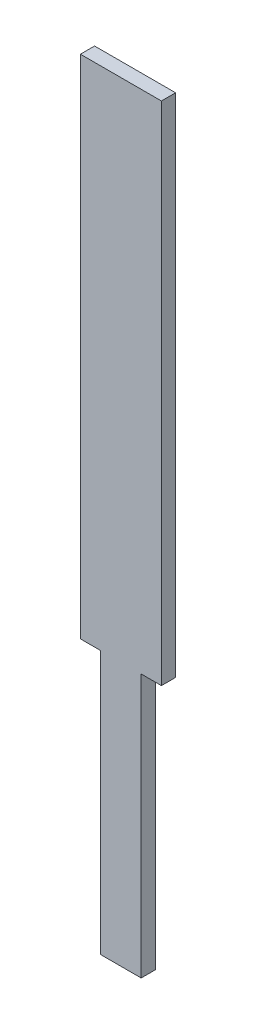
ISO-10303-21;
HEADER;
FILE_DESCRIPTION(('STEP AP214'),'2;1');
FILE_NAME('part.step','',(''),(''),'','','');
FILE_SCHEMA(('AUTOMOTIVE_DESIGN { 1 0 10303 214 1 1 1 1 }'));
ENDSEC;
DATA;
#1=APPLICATION_CONTEXT('core data for automotive mechanical design processes');
#2=APPLICATION_PROTOCOL_DEFINITION('international standard','automotive_design',2000,#1);
#3=PRODUCT_CONTEXT('',#1,'mechanical');
#4=PRODUCT('Part','Part','',(#3));
#5=PRODUCT_RELATED_PRODUCT_CATEGORY('part','',(#4));
#6=PRODUCT_DEFINITION_FORMATION('','',#4);
#7=PRODUCT_DEFINITION_CONTEXT('part definition',#1,'design');
#8=PRODUCT_DEFINITION('design','',#6,#7);
#9=PRODUCT_DEFINITION_SHAPE('','',#8);
#10=(LENGTH_UNIT() NAMED_UNIT(*) SI_UNIT(.MILLI.,.METRE.));
#11=(NAMED_UNIT(*) PLANE_ANGLE_UNIT() SI_UNIT($,.RADIAN.));
#12=(NAMED_UNIT(*) SI_UNIT($,.STERADIAN.) SOLID_ANGLE_UNIT());
#13=UNCERTAINTY_MEASURE_WITH_UNIT(LENGTH_MEASURE(1.E-05),#10,'distance_accuracy_value','');
#14=(GEOMETRIC_REPRESENTATION_CONTEXT(3) GLOBAL_UNCERTAINTY_ASSIGNED_CONTEXT((#13)) GLOBAL_UNIT_ASSIGNED_CONTEXT((#10,
#11,#12)) REPRESENTATION_CONTEXT('',''));
#15=CARTESIAN_POINT('',(0.,0.,0.));
#16=DIRECTION('',(0.,0.,1.));
#17=DIRECTION('',(1.,0.,0.));
#18=AXIS2_PLACEMENT_3D('',#15,#16,#17);
#19=CARTESIAN_POINT('',(0.,-125.,7.));
#20=DIRECTION('',(0.,1.,0.));
#21=DIRECTION('',(0.,0.,1.));
#22=AXIS2_PLACEMENT_3D('',#19,#20,#21);
#23=PLANE('',#22);
#24=DIRECTION('',(1.,0.,0.));
#25=VECTOR('',#24,1.);
#26=CARTESIAN_POINT('',(0.,-125.,0.));
#27=LINE('',#26,#25);
#28=CARTESIAN_POINT('',(-20.,-125.,0.));
#29=VERTEX_POINT('',#28);
#30=CARTESIAN_POINT('',(-10.,-125.,0.));
#31=VERTEX_POINT('',#30);
#32=EDGE_CURVE('E134',#29,#31,#27,.T.);
#33=ORIENTED_EDGE('',*,*,#32,.T.);
#34=DIRECTION('',(0.,0.,-1.));
#35=VECTOR('',#34,1.);
#36=CARTESIAN_POINT('',(-10.,-125.,7.));
#37=LINE('',#36,#35);
#38=CARTESIAN_POINT('',(-10.,-125.,7.));
#39=VERTEX_POINT('',#38);
#40=EDGE_CURVE('E11',#39,#31,#37,.T.);
#41=ORIENTED_EDGE('',*,*,#40,.F.);
#42=DIRECTION('',(1.,0.,0.));
#43=VECTOR('',#42,1.);
#44=CARTESIAN_POINT('',(0.,-125.,7.));
#45=LINE('',#44,#43);
#46=CARTESIAN_POINT('',(-20.,-125.,7.));
#47=VERTEX_POINT('',#46);
#48=EDGE_CURVE('E151',#47,#39,#45,.T.);
#49=ORIENTED_EDGE('',*,*,#48,.F.);
#50=DIRECTION('',(0.,0.,-1.));
#51=VECTOR('',#50,1.);
#52=CARTESIAN_POINT('',(-20.,-125.,7.));
#53=LINE('',#52,#51);
#54=EDGE_CURVE('E52',#47,#29,#53,.T.);
#55=ORIENTED_EDGE('',*,*,#54,.T.);
#56=EDGE_LOOP('',(#33,#41,#49,#55));
#57=FACE_BOUND('',#56,.T.);
#58=ADVANCED_FACE('F35',(#57),#23,.F.);
#59=CARTESIAN_POINT('',(-10.,0.,7.));
#60=DIRECTION('',(1.,0.,0.));
#61=DIRECTION('',(0.,1.,0.));
#62=AXIS2_PLACEMENT_3D('',#59,#60,#61);
#63=PLANE('',#62);
#64=DIRECTION('',(0.,-1.,0.));
#65=VECTOR('',#64,1.);
#66=CARTESIAN_POINT('',(-10.,0.,0.));
#67=LINE('',#66,#65);
#68=CARTESIAN_POINT('',(-9.99999999999999,-255.,0.));
#69=VERTEX_POINT('',#68);
#70=EDGE_CURVE('E136',#31,#69,#67,.T.);
#71=ORIENTED_EDGE('',*,*,#70,.T.);
#72=DIRECTION('',(0.,0.,-1.));
#73=VECTOR('',#72,1.);
#74=CARTESIAN_POINT('',(-9.99999999999999,-255.,7.));
#75=LINE('',#74,#73);
#76=CARTESIAN_POINT('',(-9.99999999999999,-255.,7.));
#77=VERTEX_POINT('',#76);
#78=EDGE_CURVE('E44',#77,#69,#75,.T.);
#79=ORIENTED_EDGE('',*,*,#78,.F.);
#80=DIRECTION('',(0.,-1.,0.));
#81=VECTOR('',#80,1.);
#82=CARTESIAN_POINT('',(-10.,0.,7.));
#83=LINE('',#82,#81);
#84=EDGE_CURVE('E90',#39,#77,#83,.T.);
#85=ORIENTED_EDGE('',*,*,#84,.F.);
#86=ORIENTED_EDGE('',*,*,#40,.T.);
#87=EDGE_LOOP('',(#71,#79,#85,#86));
#88=FACE_BOUND('',#87,.T.);
#89=ADVANCED_FACE('F37',(#88),#63,.F.);
#90=CARTESIAN_POINT('',(0.,-255.,7.));
#91=DIRECTION('',(0.,1.,0.));
#92=DIRECTION('',(0.,0.,1.));
#93=AXIS2_PLACEMENT_3D('',#90,#91,#92);
#94=PLANE('',#93);
#95=DIRECTION('',(1.,0.,0.));
#96=VECTOR('',#95,1.);
#97=CARTESIAN_POINT('',(0.,-255.,0.));
#98=LINE('',#97,#96);
#99=CARTESIAN_POINT('',(10.,-255.,0.));
#100=VERTEX_POINT('',#99);
#101=EDGE_CURVE('E139',#69,#100,#98,.T.);
#102=ORIENTED_EDGE('',*,*,#101,.T.);
#103=DIRECTION('',(0.,0.,-1.));
#104=VECTOR('',#103,1.);
#105=CARTESIAN_POINT('',(10.,-255.,7.));
#106=LINE('',#105,#104);
#107=CARTESIAN_POINT('',(10.,-255.,7.));
#108=VERTEX_POINT('',#107);
#109=EDGE_CURVE('E157',#108,#100,#106,.T.);
#110=ORIENTED_EDGE('',*,*,#109,.F.);
#111=DIRECTION('',(1.,0.,0.));
#112=VECTOR('',#111,1.);
#113=CARTESIAN_POINT('',(0.,-255.,7.));
#114=LINE('',#113,#112);
#115=EDGE_CURVE('E164',#77,#108,#114,.T.);
#116=ORIENTED_EDGE('',*,*,#115,.F.);
#117=ORIENTED_EDGE('',*,*,#78,.T.);
#118=EDGE_LOOP('',(#102,#110,#116,#117));
#119=FACE_BOUND('',#118,.T.);
#120=ADVANCED_FACE('F162',(#119),#94,.F.);
#121=CARTESIAN_POINT('',(9.99999999999998,0.,7.));
#122=DIRECTION('',(1.,0.,0.));
#123=DIRECTION('',(0.,1.,0.));
#124=AXIS2_PLACEMENT_3D('',#121,#122,#123);
#125=PLANE('',#124);
#126=DIRECTION('',(0.,-1.,0.));
#127=VECTOR('',#126,1.);
#128=CARTESIAN_POINT('',(9.99999999999998,0.,0.));
#129=LINE('',#128,#127);
#130=CARTESIAN_POINT('',(10.,-125.,0.));
#131=VERTEX_POINT('',#130);
#132=EDGE_CURVE('E142',#131,#100,#129,.T.);
#133=ORIENTED_EDGE('',*,*,#132,.F.);
#134=DIRECTION('',(0.,0.,-1.));
#135=VECTOR('',#134,1.);
#136=CARTESIAN_POINT('',(10.,-125.,7.));
#137=LINE('',#136,#135);
#138=CARTESIAN_POINT('',(10.,-125.,7.));
#139=VERTEX_POINT('',#138);
#140=EDGE_CURVE('E155',#139,#131,#137,.T.);
#141=ORIENTED_EDGE('',*,*,#140,.F.);
#142=DIRECTION('',(0.,-1.,0.));
#143=VECTOR('',#142,1.);
#144=CARTESIAN_POINT('',(9.99999999999998,0.,7.));
#145=LINE('',#144,#143);
#146=EDGE_CURVE('E172',#139,#108,#145,.T.);
#147=ORIENTED_EDGE('',*,*,#146,.T.);
#148=ORIENTED_EDGE('',*,*,#109,.T.);
#149=EDGE_LOOP('',(#133,#141,#147,#148));
#150=FACE_BOUND('',#149,.T.);
#151=ADVANCED_FACE('F170',(#150),#125,.T.);
#152=CARTESIAN_POINT('',(20.,-125.,0.));
#153=VERTEX_POINT('',#152);
#154=EDGE_CURVE('E137',#131,#153,#27,.T.);
#155=ORIENTED_EDGE('',*,*,#154,.T.);
#156=DIRECTION('',(0.,0.,-1.));
#157=VECTOR('',#156,1.);
#158=CARTESIAN_POINT('',(20.,-125.,7.));
#159=LINE('',#158,#157);
#160=CARTESIAN_POINT('',(20.,-125.,7.));
#161=VERTEX_POINT('',#160);
#162=EDGE_CURVE('E126',#161,#153,#159,.T.);
#163=ORIENTED_EDGE('',*,*,#162,.F.);
#164=EDGE_CURVE('E114',#139,#161,#45,.T.);
#165=ORIENTED_EDGE('',*,*,#164,.F.);
#166=ORIENTED_EDGE('',*,*,#140,.T.);
#167=EDGE_LOOP('',(#155,#163,#165,#166));
#168=FACE_BOUND('',#167,.T.);
#169=ADVANCED_FACE('F183',(#168),#23,.F.);
#170=CARTESIAN_POINT('',(20.,0.,7.));
#171=DIRECTION('',(-1.,0.,0.));
#172=DIRECTION('',(0.,-1.,0.));
#173=AXIS2_PLACEMENT_3D('',#170,#171,#172);
#174=PLANE('',#173);
#175=DIRECTION('',(0.,1.,0.));
#176=VECTOR('',#175,1.);
#177=CARTESIAN_POINT('',(20.,0.,0.));
#178=LINE('',#177,#176);
#179=CARTESIAN_POINT('',(20.,125.,0.));
#180=VERTEX_POINT('',#179);
#181=EDGE_CURVE('E123',#153,#180,#178,.T.);
#182=ORIENTED_EDGE('',*,*,#181,.T.);
#183=DIRECTION('',(0.,0.,-1.));
#184=VECTOR('',#183,1.);
#185=CARTESIAN_POINT('',(20.,125.,7.));
#186=LINE('',#185,#184);
#187=CARTESIAN_POINT('',(20.,125.,7.));
#188=VERTEX_POINT('',#187);
#189=EDGE_CURVE('E120',#188,#180,#186,.T.);
#190=ORIENTED_EDGE('',*,*,#189,.F.);
#191=DIRECTION('',(0.,1.,0.));
#192=VECTOR('',#191,1.);
#193=CARTESIAN_POINT('',(20.,0.,7.));
#194=LINE('',#193,#192);
#195=EDGE_CURVE('E106',#161,#188,#194,.T.);
#196=ORIENTED_EDGE('',*,*,#195,.F.);
#197=ORIENTED_EDGE('',*,*,#162,.T.);
#198=EDGE_LOOP('',(#182,#190,#196,#197));
#199=FACE_BOUND('',#198,.T.);
#200=ADVANCED_FACE('F121',(#199),#174,.F.);
#201=CARTESIAN_POINT('',(0.,125.,7.));
#202=DIRECTION('',(0.,1.,0.));
#203=DIRECTION('',(0.,0.,1.));
#204=AXIS2_PLACEMENT_3D('',#201,#202,#203);
#205=PLANE('',#204);
#206=DIRECTION('',(1.,0.,0.));
#207=VECTOR('',#206,1.);
#208=CARTESIAN_POINT('',(0.,125.,0.));
#209=LINE('',#208,#207);
#210=CARTESIAN_POINT('',(-20.,125.,0.));
#211=VERTEX_POINT('',#210);
#212=EDGE_CURVE('E146',#211,#180,#209,.T.);
#213=ORIENTED_EDGE('',*,*,#212,.F.);
#214=DIRECTION('',(0.,0.,-1.));
#215=VECTOR('',#214,1.);
#216=CARTESIAN_POINT('',(-20.,125.,7.));
#217=LINE('',#216,#215);
#218=CARTESIAN_POINT('',(-20.,125.,7.));
#219=VERTEX_POINT('',#218);
#220=EDGE_CURVE('E78',#219,#211,#217,.T.);
#221=ORIENTED_EDGE('',*,*,#220,.F.);
#222=DIRECTION('',(1.,0.,0.));
#223=VECTOR('',#222,1.);
#224=CARTESIAN_POINT('',(0.,125.,7.));
#225=LINE('',#224,#223);
#226=EDGE_CURVE('E111',#219,#188,#225,.T.);
#227=ORIENTED_EDGE('',*,*,#226,.T.);
#228=ORIENTED_EDGE('',*,*,#189,.T.);
#229=EDGE_LOOP('',(#213,#221,#227,#228));
#230=FACE_BOUND('',#229,.T.);
#231=ADVANCED_FACE('F128',(#230),#205,.T.);
#232=CARTESIAN_POINT('',(-20.,0.,7.));
#233=DIRECTION('',(-1.,0.,0.));
#234=DIRECTION('',(0.,0.,1.));
#235=AXIS2_PLACEMENT_3D('',#232,#233,#234);
#236=PLANE('',#235);
#237=DIRECTION('',(0.,1.,0.));
#238=VECTOR('',#237,1.);
#239=CARTESIAN_POINT('',(-20.,0.,0.));
#240=LINE('',#239,#238);
#241=EDGE_CURVE('E148',#29,#211,#240,.T.);
#242=ORIENTED_EDGE('',*,*,#241,.F.);
#243=ORIENTED_EDGE('',*,*,#54,.F.);
#244=DIRECTION('',(0.,1.,0.));
#245=VECTOR('',#244,1.);
#246=CARTESIAN_POINT('',(-20.,0.,7.));
#247=LINE('',#246,#245);
#248=EDGE_CURVE('E129',#47,#219,#247,.T.);
#249=ORIENTED_EDGE('',*,*,#248,.T.);
#250=ORIENTED_EDGE('',*,*,#220,.T.);
#251=EDGE_LOOP('',(#242,#243,#249,#250));
#252=FACE_BOUND('',#251,.T.);
#253=ADVANCED_FACE('F194',(#252),#236,.T.);
#254=CARTESIAN_POINT('',(0.,0.,7.));
#255=DIRECTION('',(0.,0.,1.));
#256=DIRECTION('',(1.,0.,0.));
#257=AXIS2_PLACEMENT_3D('',#254,#255,#256);
#258=PLANE('',#257);
#259=ORIENTED_EDGE('',*,*,#48,.T.);
#260=ORIENTED_EDGE('',*,*,#84,.T.);
#261=ORIENTED_EDGE('',*,*,#115,.T.);
#262=ORIENTED_EDGE('',*,*,#146,.F.);
#263=ORIENTED_EDGE('',*,*,#164,.T.);
#264=ORIENTED_EDGE('',*,*,#195,.T.);
#265=ORIENTED_EDGE('',*,*,#226,.F.);
#266=ORIENTED_EDGE('',*,*,#248,.F.);
#267=EDGE_LOOP('',(#259,#260,#261,#262,#263,#264,#265,#266));
#268=FACE_BOUND('',#267,.T.);
#269=ADVANCED_FACE('F108',(#268),#258,.T.);
#270=CARTESIAN_POINT('',(0.,0.,0.));
#271=DIRECTION('',(0.,0.,1.));
#272=DIRECTION('',(1.,0.,0.));
#273=AXIS2_PLACEMENT_3D('',#270,#271,#272);
#274=PLANE('',#273);
#275=ORIENTED_EDGE('',*,*,#32,.F.);
#276=ORIENTED_EDGE('',*,*,#241,.T.);
#277=ORIENTED_EDGE('',*,*,#212,.T.);
#278=ORIENTED_EDGE('',*,*,#181,.F.);
#279=ORIENTED_EDGE('',*,*,#154,.F.);
#280=ORIENTED_EDGE('',*,*,#132,.T.);
#281=ORIENTED_EDGE('',*,*,#101,.F.);
#282=ORIENTED_EDGE('',*,*,#70,.F.);
#283=EDGE_LOOP('',(#275,#276,#277,#278,#279,#280,#281,#282));
#284=FACE_BOUND('',#283,.T.);
#285=ADVANCED_FACE('F166',(#284),#274,.F.);
#286=CLOSED_SHELL('',(#58,#89,#120,#151,#169,#200,#231,#253,#269,#285));
#287=MANIFOLD_SOLID_BREP('B2',#286);
#288=ADVANCED_BREP_SHAPE_REPRESENTATION('',(#18,#287),#14);
#289=SHAPE_DEFINITION_REPRESENTATION(#9,#288);
ENDSEC;
END-ISO-10303-21;
